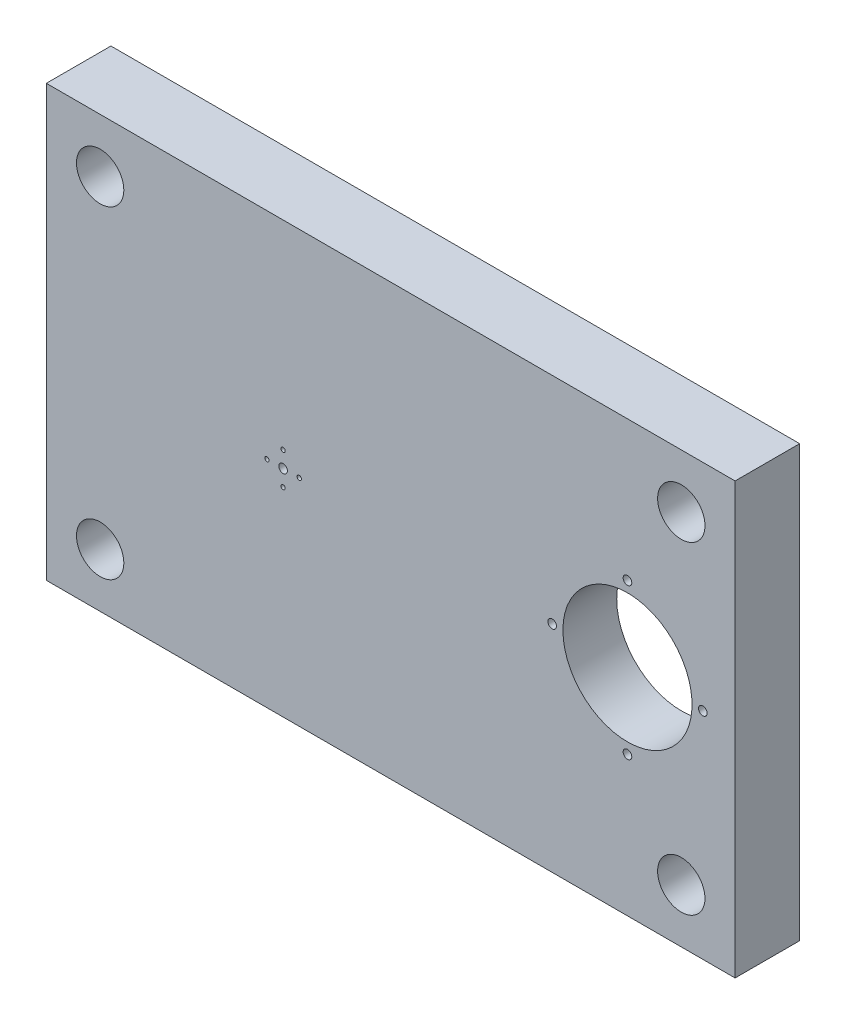
ISO-10303-21;
HEADER;
FILE_DESCRIPTION(('STEP AP214'),'2;1');
FILE_NAME('part.step','',(''),(''),'','','');
FILE_SCHEMA(('AUTOMOTIVE_DESIGN { 1 0 10303 214 1 1 1 1 }'));
ENDSEC;
DATA;
#1=APPLICATION_CONTEXT('core data for automotive mechanical design processes');
#2=APPLICATION_PROTOCOL_DEFINITION('international standard','automotive_design',2000,#1);
#3=PRODUCT_CONTEXT('',#1,'mechanical');
#4=PRODUCT('Part','Part','',(#3));
#5=PRODUCT_RELATED_PRODUCT_CATEGORY('part','',(#4));
#6=PRODUCT_DEFINITION_FORMATION('','',#4);
#7=PRODUCT_DEFINITION_CONTEXT('part definition',#1,'design');
#8=PRODUCT_DEFINITION('design','',#6,#7);
#9=PRODUCT_DEFINITION_SHAPE('','',#8);
#10=(LENGTH_UNIT() NAMED_UNIT(*) SI_UNIT(.MILLI.,.METRE.));
#11=(NAMED_UNIT(*) PLANE_ANGLE_UNIT() SI_UNIT($,.RADIAN.));
#12=(NAMED_UNIT(*) SI_UNIT($,.STERADIAN.) SOLID_ANGLE_UNIT());
#13=UNCERTAINTY_MEASURE_WITH_UNIT(LENGTH_MEASURE(1.E-05),#10,'distance_accuracy_value','');
#14=(GEOMETRIC_REPRESENTATION_CONTEXT(3) GLOBAL_UNCERTAINTY_ASSIGNED_CONTEXT((#13)) GLOBAL_UNIT_ASSIGNED_CONTEXT((#10,
#11,#12)) REPRESENTATION_CONTEXT('',''));
#15=CARTESIAN_POINT('',(0.,0.,0.));
#16=DIRECTION('',(0.,0.,1.));
#17=DIRECTION('',(1.,0.,0.));
#18=AXIS2_PLACEMENT_3D('',#15,#16,#17);
#19=CARTESIAN_POINT('',(0.,0.,30.));
#20=DIRECTION('',(1.,0.,0.));
#21=DIRECTION('',(0.,0.,-1.));
#22=AXIS2_PLACEMENT_3D('',#19,#20,#21);
#23=PLANE('',#22);
#24=DIRECTION('',(0.,-1.,0.));
#25=VECTOR('',#24,1.);
#26=CARTESIAN_POINT('',(0.,0.,0.));
#27=LINE('',#26,#25);
#28=CARTESIAN_POINT('',(0.,200.,0.));
#29=VERTEX_POINT('',#28);
#30=CARTESIAN_POINT('',(0.,0.,0.));
#31=VERTEX_POINT('',#30);
#32=EDGE_CURVE('E195',#29,#31,#27,.T.);
#33=ORIENTED_EDGE('',*,*,#32,.T.);
#34=DIRECTION('',(0.,0.,-1.));
#35=VECTOR('',#34,1.);
#36=CARTESIAN_POINT('',(0.,0.,30.));
#37=LINE('',#36,#35);
#38=CARTESIAN_POINT('',(0.,0.,30.));
#39=VERTEX_POINT('',#38);
#40=EDGE_CURVE('E222',#39,#31,#37,.T.);
#41=ORIENTED_EDGE('',*,*,#40,.F.);
#42=DIRECTION('',(0.,-1.,0.));
#43=VECTOR('',#42,1.);
#44=CARTESIAN_POINT('',(0.,0.,30.));
#45=LINE('',#44,#43);
#46=CARTESIAN_POINT('',(0.,200.,30.));
#47=VERTEX_POINT('',#46);
#48=EDGE_CURVE('E196',#47,#39,#45,.T.);
#49=ORIENTED_EDGE('',*,*,#48,.F.);
#50=DIRECTION('',(0.,0.,-1.));
#51=VECTOR('',#50,1.);
#52=CARTESIAN_POINT('',(0.,200.,30.));
#53=LINE('',#52,#51);
#54=EDGE_CURVE('E206',#47,#29,#53,.T.);
#55=ORIENTED_EDGE('',*,*,#54,.T.);
#56=EDGE_LOOP('',(#33,#41,#49,#55));
#57=FACE_BOUND('',#56,.T.);
#58=DIRECTION('',(0.,1.,0.));
#59=VECTOR('',#58,1.);
#60=CARTESIAN_POINT('',(0.,0.,25.));
#61=LINE('',#60,#59);
#62=CARTESIAN_POINT('',(0.,84.,25.));
#63=VERTEX_POINT('',#62);
#64=CARTESIAN_POINT('',(0.,116.,25.));
#65=VERTEX_POINT('',#64);
#66=EDGE_CURVE('E11',#63,#65,#61,.T.);
#67=ORIENTED_EDGE('',*,*,#66,.F.);
#68=DIRECTION('',(0.,0.,-1.));
#69=VECTOR('',#68,1.);
#70=CARTESIAN_POINT('',(0.,84.,30.));
#71=LINE('',#70,#69);
#72=CARTESIAN_POINT('',(0.,84.,5.));
#73=VERTEX_POINT('',#72);
#74=EDGE_CURVE('E127',#63,#73,#71,.T.);
#75=ORIENTED_EDGE('',*,*,#74,.T.);
#76=DIRECTION('',(0.,1.,0.));
#77=VECTOR('',#76,1.);
#78=CARTESIAN_POINT('',(0.,0.,5.));
#79=LINE('',#78,#77);
#80=CARTESIAN_POINT('',(0.,116.,5.));
#81=VERTEX_POINT('',#80);
#82=EDGE_CURVE('E225',#73,#81,#79,.T.);
#83=ORIENTED_EDGE('',*,*,#82,.T.);
#84=DIRECTION('',(0.,0.,1.));
#85=VECTOR('',#84,1.);
#86=CARTESIAN_POINT('',(0.,116.,30.));
#87=LINE('',#86,#85);
#88=EDGE_CURVE('E48',#81,#65,#87,.T.);
#89=ORIENTED_EDGE('',*,*,#88,.T.);
#90=EDGE_LOOP('',(#67,#75,#83,#89));
#91=FACE_BOUND('',#90,.T.);
#92=ADVANCED_FACE('F40',(#57,#91),#23,.F.);
#93=CARTESIAN_POINT('',(295.,175.,30.));
#94=DIRECTION('',(0.,0.,-1.));
#95=DIRECTION('',(-1.,0.,0.));
#96=AXIS2_PLACEMENT_3D('',#93,#94,#95);
#97=CYLINDRICAL_SURFACE('',#96,8.09999999999998);
#98=CARTESIAN_POINT('',(295.,175.,0.));
#99=DIRECTION('',(0.,0.,1.));
#100=DIRECTION('',(1.,0.,0.));
#101=AXIS2_PLACEMENT_3D('',#98,#99,#100);
#102=CIRCLE('',#101,8.09999999999998);
#103=CARTESIAN_POINT('',(303.1,175.,0.));
#104=VERTEX_POINT('',#103);
#105=EDGE_CURVE('E189',#104,#104,#102,.T.);
#106=ORIENTED_EDGE('',*,*,#105,.F.);
#107=EDGE_LOOP('',(#106));
#108=FACE_BOUND('',#107,.T.);
#109=CARTESIAN_POINT('',(295.,175.,10.));
#110=DIRECTION('',(0.,0.,1.));
#111=DIRECTION('',(1.,0.,0.));
#112=AXIS2_PLACEMENT_3D('',#109,#110,#111);
#113=CIRCLE('',#112,8.09999999999998);
#114=CARTESIAN_POINT('',(303.1,175.,10.));
#115=VERTEX_POINT('',#114);
#116=EDGE_CURVE('E159',#115,#115,#113,.T.);
#117=ORIENTED_EDGE('',*,*,#116,.T.);
#118=EDGE_LOOP('',(#117));
#119=FACE_BOUND('',#118,.T.);
#120=ADVANCED_FACE('F321',(#108,#119),#97,.F.);
#121=CARTESIAN_POINT('',(295.,25.,30.));
#122=DIRECTION('',(0.,0.,-1.));
#123=DIRECTION('',(-1.,0.,0.));
#124=AXIS2_PLACEMENT_3D('',#121,#122,#123);
#125=CYLINDRICAL_SURFACE('',#124,8.09999999999998);
#126=CARTESIAN_POINT('',(295.,25.,0.));
#127=DIRECTION('',(0.,0.,1.));
#128=DIRECTION('',(1.,0.,0.));
#129=AXIS2_PLACEMENT_3D('',#126,#127,#128);
#130=CIRCLE('',#129,8.09999999999998);
#131=CARTESIAN_POINT('',(303.1,25.,0.));
#132=VERTEX_POINT('',#131);
#133=EDGE_CURVE('E183',#132,#132,#130,.T.);
#134=ORIENTED_EDGE('',*,*,#133,.F.);
#135=EDGE_LOOP('',(#134));
#136=FACE_BOUND('',#135,.T.);
#137=CARTESIAN_POINT('',(295.,25.,10.));
#138=DIRECTION('',(0.,0.,1.));
#139=DIRECTION('',(1.,0.,0.));
#140=AXIS2_PLACEMENT_3D('',#137,#138,#139);
#141=CIRCLE('',#140,8.09999999999998);
#142=CARTESIAN_POINT('',(303.1,25.,10.));
#143=VERTEX_POINT('',#142);
#144=EDGE_CURVE('E165',#143,#143,#141,.T.);
#145=ORIENTED_EDGE('',*,*,#144,.T.);
#146=EDGE_LOOP('',(#145));
#147=FACE_BOUND('',#146,.T.);
#148=ADVANCED_FACE('F326',(#136,#147),#125,.F.);
#149=CARTESIAN_POINT('',(25.,25.,30.));
#150=DIRECTION('',(0.,0.,-1.));
#151=DIRECTION('',(-1.,0.,0.));
#152=AXIS2_PLACEMENT_3D('',#149,#150,#151);
#153=CYLINDRICAL_SURFACE('',#152,8.1);
#154=CARTESIAN_POINT('',(25.,25.,0.));
#155=DIRECTION('',(0.,0.,1.));
#156=DIRECTION('',(1.,0.,0.));
#157=AXIS2_PLACEMENT_3D('',#154,#155,#156);
#158=CIRCLE('',#157,8.1);
#159=CARTESIAN_POINT('',(33.1,25.,0.));
#160=VERTEX_POINT('',#159);
#161=EDGE_CURVE('E186',#160,#160,#158,.T.);
#162=ORIENTED_EDGE('',*,*,#161,.F.);
#163=EDGE_LOOP('',(#162));
#164=FACE_BOUND('',#163,.T.);
#165=CARTESIAN_POINT('',(25.,25.,10.));
#166=DIRECTION('',(0.,0.,1.));
#167=DIRECTION('',(1.,0.,0.));
#168=AXIS2_PLACEMENT_3D('',#165,#166,#167);
#169=CIRCLE('',#168,8.1);
#170=CARTESIAN_POINT('',(33.1,25.,10.));
#171=VERTEX_POINT('',#170);
#172=EDGE_CURVE('E172',#171,#171,#169,.T.);
#173=ORIENTED_EDGE('',*,*,#172,.T.);
#174=EDGE_LOOP('',(#173));
#175=FACE_BOUND('',#174,.T.);
#176=ADVANCED_FACE('F364',(#164,#175),#153,.F.);
#177=CARTESIAN_POINT('',(25.,175.,30.));
#178=DIRECTION('',(0.,0.,-1.));
#179=DIRECTION('',(-1.,0.,0.));
#180=AXIS2_PLACEMENT_3D('',#177,#178,#179);
#181=CYLINDRICAL_SURFACE('',#180,8.09999999999999);
#182=CARTESIAN_POINT('',(25.,175.,0.));
#183=DIRECTION('',(0.,0.,1.));
#184=DIRECTION('',(1.,0.,0.));
#185=AXIS2_PLACEMENT_3D('',#182,#183,#184);
#186=CIRCLE('',#185,8.09999999999999);
#187=CARTESIAN_POINT('',(33.1,175.,0.));
#188=VERTEX_POINT('',#187);
#189=EDGE_CURVE('E192',#188,#188,#186,.T.);
#190=ORIENTED_EDGE('',*,*,#189,.F.);
#191=EDGE_LOOP('',(#190));
#192=FACE_BOUND('',#191,.T.);
#193=CARTESIAN_POINT('',(25.,175.,10.));
#194=DIRECTION('',(0.,0.,1.));
#195=DIRECTION('',(1.,0.,0.));
#196=AXIS2_PLACEMENT_3D('',#193,#194,#195);
#197=CIRCLE('',#196,8.09999999999999);
#198=CARTESIAN_POINT('',(33.1,175.,10.));
#199=VERTEX_POINT('',#198);
#200=EDGE_CURVE('E179',#199,#199,#197,.T.);
#201=ORIENTED_EDGE('',*,*,#200,.T.);
#202=EDGE_LOOP('',(#201));
#203=FACE_BOUND('',#202,.T.);
#204=ADVANCED_FACE('F384',(#192,#203),#181,.F.);
#205=CARTESIAN_POINT('',(0.,200.,30.));
#206=DIRECTION('',(0.,0.,-1.));
#207=DIRECTION('',(-1.,0.,0.));
#208=AXIS2_PLACEMENT_3D('',#205,#206,#207);
#209=PLANE('',#208);
#210=CARTESIAN_POINT('',(102.5,100.,30.));
#211=DIRECTION('',(0.,0.,1.));
#212=DIRECTION('',(1.,0.,0.));
#213=AXIS2_PLACEMENT_3D('',#210,#211,#212);
#214=CIRCLE('',#213,0.999999999999998);
#215=CARTESIAN_POINT('',(103.5,100.,30.));
#216=VERTEX_POINT('',#215);
#217=EDGE_CURVE('E279',#216,#216,#214,.T.);
#218=ORIENTED_EDGE('',*,*,#217,.F.);
#219=EDGE_LOOP('',(#218));
#220=FACE_BOUND('',#219,.T.);
#221=CARTESIAN_POINT('',(110.,92.5,30.));
#222=DIRECTION('',(0.,0.,1.));
#223=DIRECTION('',(1.,0.,0.));
#224=AXIS2_PLACEMENT_3D('',#221,#222,#223);
#225=CIRCLE('',#224,0.999999999999998);
#226=CARTESIAN_POINT('',(111.,92.5,30.));
#227=VERTEX_POINT('',#226);
#228=EDGE_CURVE('E269',#227,#227,#225,.T.);
#229=ORIENTED_EDGE('',*,*,#228,.F.);
#230=EDGE_LOOP('',(#229));
#231=FACE_BOUND('',#230,.T.);
#232=CARTESIAN_POINT('',(117.5,100.,30.));
#233=DIRECTION('',(0.,0.,1.));
#234=DIRECTION('',(1.,0.,0.));
#235=AXIS2_PLACEMENT_3D('',#232,#233,#234);
#236=CIRCLE('',#235,0.999999999999998);
#237=CARTESIAN_POINT('',(118.5,100.,30.));
#238=VERTEX_POINT('',#237);
#239=EDGE_CURVE('E266',#238,#238,#236,.T.);
#240=ORIENTED_EDGE('',*,*,#239,.F.);
#241=EDGE_LOOP('',(#240));
#242=FACE_BOUND('',#241,.T.);
#243=CARTESIAN_POINT('',(110.,107.5,30.));
#244=DIRECTION('',(0.,0.,1.));
#245=DIRECTION('',(1.,0.,0.));
#246=AXIS2_PLACEMENT_3D('',#243,#244,#245);
#247=CIRCLE('',#246,0.999999999999998);
#248=CARTESIAN_POINT('',(111.,107.5,30.));
#249=VERTEX_POINT('',#248);
#250=EDGE_CURVE('E263',#249,#249,#247,.T.);
#251=ORIENTED_EDGE('',*,*,#250,.F.);
#252=EDGE_LOOP('',(#251));
#253=FACE_BOUND('',#252,.T.);
#254=CARTESIAN_POINT('',(305.,100.,30.));
#255=DIRECTION('',(0.,0.,-1.));
#256=DIRECTION('',(-1.,0.,0.));
#257=AXIS2_PLACEMENT_3D('',#254,#255,#256);
#258=CIRCLE('',#257,2.);
#259=CARTESIAN_POINT('',(303.,100.,30.));
#260=VERTEX_POINT('',#259);
#261=EDGE_CURVE('E259',#260,#260,#258,.T.);
#262=ORIENTED_EDGE('',*,*,#261,.T.);
#263=EDGE_LOOP('',(#262));
#264=FACE_BOUND('',#263,.T.);
#265=CARTESIAN_POINT('',(270.,65.,30.));
#266=DIRECTION('',(0.,0.,-1.));
#267=DIRECTION('',(-1.,0.,0.));
#268=AXIS2_PLACEMENT_3D('',#265,#266,#267);
#269=CIRCLE('',#268,2.);
#270=CARTESIAN_POINT('',(268.,65.,30.));
#271=VERTEX_POINT('',#270);
#272=EDGE_CURVE('E255',#271,#271,#269,.T.);
#273=ORIENTED_EDGE('',*,*,#272,.T.);
#274=EDGE_LOOP('',(#273));
#275=FACE_BOUND('',#274,.T.);
#276=CARTESIAN_POINT('',(235.,100.,30.));
#277=DIRECTION('',(0.,0.,-1.));
#278=DIRECTION('',(-1.,0.,0.));
#279=AXIS2_PLACEMENT_3D('',#276,#277,#278);
#280=CIRCLE('',#279,2.);
#281=CARTESIAN_POINT('',(233.,100.,30.));
#282=VERTEX_POINT('',#281);
#283=EDGE_CURVE('E251',#282,#282,#280,.T.);
#284=ORIENTED_EDGE('',*,*,#283,.T.);
#285=EDGE_LOOP('',(#284));
#286=FACE_BOUND('',#285,.T.);
#287=CARTESIAN_POINT('',(270.,135.,30.));
#288=DIRECTION('',(0.,0.,-1.));
#289=DIRECTION('',(-1.,0.,0.));
#290=AXIS2_PLACEMENT_3D('',#287,#288,#289);
#291=CIRCLE('',#290,2.);
#292=CARTESIAN_POINT('',(268.,135.,30.));
#293=VERTEX_POINT('',#292);
#294=EDGE_CURVE('E247',#293,#293,#291,.T.);
#295=ORIENTED_EDGE('',*,*,#294,.T.);
#296=EDGE_LOOP('',(#295));
#297=FACE_BOUND('',#296,.T.);
#298=CARTESIAN_POINT('',(270.,100.,30.));
#299=DIRECTION('',(0.,0.,-1.));
#300=DIRECTION('',(-1.,0.,0.));
#301=AXIS2_PLACEMENT_3D('',#298,#299,#300);
#302=CIRCLE('',#301,30.);
#303=CARTESIAN_POINT('',(240.,100.,30.));
#304=VERTEX_POINT('',#303);
#305=EDGE_CURVE('E243',#304,#304,#302,.T.);
#306=ORIENTED_EDGE('',*,*,#305,.T.);
#307=EDGE_LOOP('',(#306));
#308=FACE_BOUND('',#307,.T.);
#309=CARTESIAN_POINT('',(110.,100.,30.));
#310=DIRECTION('',(0.,0.,-1.));
#311=DIRECTION('',(-1.,0.,0.));
#312=AXIS2_PLACEMENT_3D('',#309,#310,#311);
#313=CIRCLE('',#312,2.);
#314=CARTESIAN_POINT('',(108.,100.,30.));
#315=VERTEX_POINT('',#314);
#316=EDGE_CURVE('E144',#315,#315,#313,.T.);
#317=ORIENTED_EDGE('',*,*,#316,.T.);
#318=EDGE_LOOP('',(#317));
#319=FACE_BOUND('',#318,.T.);
#320=CARTESIAN_POINT('',(295.,175.,30.));
#321=DIRECTION('',(0.,0.,1.));
#322=DIRECTION('',(1.,0.,0.));
#323=AXIS2_PLACEMENT_3D('',#320,#321,#322);
#324=CIRCLE('',#323,11.);
#325=CARTESIAN_POINT('',(306.,175.,30.));
#326=VERTEX_POINT('',#325);
#327=EDGE_CURVE('E152',#326,#326,#324,.T.);
#328=ORIENTED_EDGE('',*,*,#327,.F.);
#329=EDGE_LOOP('',(#328));
#330=FACE_BOUND('',#329,.T.);
#331=CARTESIAN_POINT('',(295.,25.,30.));
#332=DIRECTION('',(0.,0.,1.));
#333=DIRECTION('',(1.,0.,0.));
#334=AXIS2_PLACEMENT_3D('',#331,#332,#333);
#335=CIRCLE('',#334,11.);
#336=CARTESIAN_POINT('',(306.,25.,30.));
#337=VERTEX_POINT('',#336);
#338=EDGE_CURVE('E166',#337,#337,#335,.T.);
#339=ORIENTED_EDGE('',*,*,#338,.F.);
#340=EDGE_LOOP('',(#339));
#341=FACE_BOUND('',#340,.T.);
#342=CARTESIAN_POINT('',(25.,25.,30.));
#343=DIRECTION('',(0.,0.,1.));
#344=DIRECTION('',(1.,0.,0.));
#345=AXIS2_PLACEMENT_3D('',#342,#343,#344);
#346=CIRCLE('',#345,11.);
#347=CARTESIAN_POINT('',(36.,25.,30.));
#348=VERTEX_POINT('',#347);
#349=EDGE_CURVE('E173',#348,#348,#346,.T.);
#350=ORIENTED_EDGE('',*,*,#349,.F.);
#351=EDGE_LOOP('',(#350));
#352=FACE_BOUND('',#351,.T.);
#353=CARTESIAN_POINT('',(25.,175.,30.));
#354=DIRECTION('',(0.,0.,1.));
#355=DIRECTION('',(1.,0.,0.));
#356=AXIS2_PLACEMENT_3D('',#353,#354,#355);
#357=CIRCLE('',#356,11.);
#358=CARTESIAN_POINT('',(36.,175.,30.));
#359=VERTEX_POINT('',#358);
#360=EDGE_CURVE('E180',#359,#359,#357,.T.);
#361=ORIENTED_EDGE('',*,*,#360,.F.);
#362=EDGE_LOOP('',(#361));
#363=FACE_BOUND('',#362,.T.);
#364=ORIENTED_EDGE('',*,*,#48,.T.);
#365=DIRECTION('',(1.,0.,0.));
#366=VECTOR('',#365,1.);
#367=CARTESIAN_POINT('',(0.,0.,30.));
#368=LINE('',#367,#366);
#369=CARTESIAN_POINT('',(320.,0.,30.));
#370=VERTEX_POINT('',#369);
#371=EDGE_CURVE('E199',#39,#370,#368,.T.);
#372=ORIENTED_EDGE('',*,*,#371,.T.);
#373=DIRECTION('',(0.,1.,0.));
#374=VECTOR('',#373,1.);
#375=CARTESIAN_POINT('',(320.,0.,30.));
#376=LINE('',#375,#374);
#377=CARTESIAN_POINT('',(320.,200.,30.));
#378=VERTEX_POINT('',#377);
#379=EDGE_CURVE('E202',#370,#378,#376,.T.);
#380=ORIENTED_EDGE('',*,*,#379,.T.);
#381=DIRECTION('',(-1.,0.,0.));
#382=VECTOR('',#381,1.);
#383=CARTESIAN_POINT('',(0.,200.,30.));
#384=LINE('',#383,#382);
#385=EDGE_CURVE('E204',#378,#47,#384,.T.);
#386=ORIENTED_EDGE('',*,*,#385,.T.);
#387=EDGE_LOOP('',(#364,#372,#380,#386));
#388=FACE_BOUND('',#387,.T.);
#389=ADVANCED_FACE('F349',(#220,#231,#242,#253,#264,#275,#286,#297,#308,#319,#330,#341,#352,
#363,#388),#209,.F.);
#390=CARTESIAN_POINT('',(0.,200.,0.));
#391=DIRECTION('',(0.,0.,-1.));
#392=DIRECTION('',(-1.,0.,0.));
#393=AXIS2_PLACEMENT_3D('',#390,#391,#392);
#394=PLANE('',#393);
#395=CARTESIAN_POINT('',(270.,100.,0.));
#396=DIRECTION('',(0.,0.,-1.));
#397=DIRECTION('',(-1.,0.,0.));
#398=AXIS2_PLACEMENT_3D('',#395,#396,#397);
#399=CIRCLE('',#398,40.);
#400=CARTESIAN_POINT('',(230.,100.,0.));
#401=VERTEX_POINT('',#400);
#402=EDGE_CURVE('E242',#401,#401,#399,.T.);
#403=ORIENTED_EDGE('',*,*,#402,.F.);
#404=EDGE_LOOP('',(#403));
#405=FACE_BOUND('',#404,.T.);
#406=CARTESIAN_POINT('',(110.,100.,0.));
#407=DIRECTION('',(0.,0.,-1.));
#408=DIRECTION('',(-1.,0.,0.));
#409=AXIS2_PLACEMENT_3D('',#406,#407,#408);
#410=CIRCLE('',#409,58.5);
#411=CARTESIAN_POINT('',(51.5,100.,0.));
#412=VERTEX_POINT('',#411);
#413=EDGE_CURVE('E153',#412,#412,#410,.T.);
#414=ORIENTED_EDGE('',*,*,#413,.F.);
#415=EDGE_LOOP('',(#414));
#416=FACE_BOUND('',#415,.T.);
#417=ORIENTED_EDGE('',*,*,#161,.T.);
#418=EDGE_LOOP('',(#417));
#419=FACE_BOUND('',#418,.T.);
#420=ORIENTED_EDGE('',*,*,#189,.T.);
#421=EDGE_LOOP('',(#420));
#422=FACE_BOUND('',#421,.T.);
#423=ORIENTED_EDGE('',*,*,#32,.F.);
#424=DIRECTION('',(-1.,0.,0.));
#425=VECTOR('',#424,1.);
#426=CARTESIAN_POINT('',(0.,200.,0.));
#427=LINE('',#426,#425);
#428=CARTESIAN_POINT('',(320.,200.,0.));
#429=VERTEX_POINT('',#428);
#430=EDGE_CURVE('E200',#429,#29,#427,.T.);
#431=ORIENTED_EDGE('',*,*,#430,.F.);
#432=DIRECTION('',(0.,1.,0.));
#433=VECTOR('',#432,1.);
#434=CARTESIAN_POINT('',(320.,0.,0.));
#435=LINE('',#434,#433);
#436=CARTESIAN_POINT('',(320.,0.,0.));
#437=VERTEX_POINT('',#436);
#438=EDGE_CURVE('E211',#437,#429,#435,.T.);
#439=ORIENTED_EDGE('',*,*,#438,.F.);
#440=DIRECTION('',(1.,0.,0.));
#441=VECTOR('',#440,1.);
#442=CARTESIAN_POINT('',(0.,0.,0.));
#443=LINE('',#442,#441);
#444=EDGE_CURVE('E209',#31,#437,#443,.T.);
#445=ORIENTED_EDGE('',*,*,#444,.F.);
#446=EDGE_LOOP('',(#423,#431,#439,#445));
#447=FACE_BOUND('',#446,.T.);
#448=ORIENTED_EDGE('',*,*,#105,.T.);
#449=EDGE_LOOP('',(#448));
#450=FACE_BOUND('',#449,.T.);
#451=ORIENTED_EDGE('',*,*,#133,.T.);
#452=EDGE_LOOP('',(#451));
#453=FACE_BOUND('',#452,.T.);
#454=ADVANCED_FACE('F345',(#405,#416,#419,#422,#447,#450,#453),#394,.T.);
#455=CARTESIAN_POINT('',(0.,0.,30.));
#456=DIRECTION('',(0.,1.,0.));
#457=DIRECTION('',(0.,0.,1.));
#458=AXIS2_PLACEMENT_3D('',#455,#456,#457);
#459=PLANE('',#458);
#460=ORIENTED_EDGE('',*,*,#444,.T.);
#461=DIRECTION('',(0.,0.,-1.));
#462=VECTOR('',#461,1.);
#463=CARTESIAN_POINT('',(320.,0.,30.));
#464=LINE('',#463,#462);
#465=EDGE_CURVE('E219',#370,#437,#464,.T.);
#466=ORIENTED_EDGE('',*,*,#465,.F.);
#467=ORIENTED_EDGE('',*,*,#371,.F.);
#468=ORIENTED_EDGE('',*,*,#40,.T.);
#469=EDGE_LOOP('',(#460,#466,#467,#468));
#470=FACE_BOUND('',#469,.T.);
#471=ADVANCED_FACE('F348',(#470),#459,.F.);
#472=CARTESIAN_POINT('',(320.,0.,30.));
#473=DIRECTION('',(-1.,0.,0.));
#474=DIRECTION('',(0.,0.,1.));
#475=AXIS2_PLACEMENT_3D('',#472,#473,#474);
#476=PLANE('',#475);
#477=ORIENTED_EDGE('',*,*,#438,.T.);
#478=DIRECTION('',(0.,0.,-1.));
#479=VECTOR('',#478,1.);
#480=CARTESIAN_POINT('',(320.,200.,30.));
#481=LINE('',#480,#479);
#482=EDGE_CURVE('E216',#378,#429,#481,.T.);
#483=ORIENTED_EDGE('',*,*,#482,.F.);
#484=ORIENTED_EDGE('',*,*,#379,.F.);
#485=ORIENTED_EDGE('',*,*,#465,.T.);
#486=EDGE_LOOP('',(#477,#483,#484,#485));
#487=FACE_BOUND('',#486,.T.);
#488=ADVANCED_FACE('F400',(#487),#476,.F.);
#489=CARTESIAN_POINT('',(0.,200.,30.));
#490=DIRECTION('',(0.,-1.,0.));
#491=DIRECTION('',(0.,0.,-1.));
#492=AXIS2_PLACEMENT_3D('',#489,#490,#491);
#493=PLANE('',#492);
#494=ORIENTED_EDGE('',*,*,#430,.T.);
#495=ORIENTED_EDGE('',*,*,#54,.F.);
#496=ORIENTED_EDGE('',*,*,#385,.F.);
#497=ORIENTED_EDGE('',*,*,#482,.T.);
#498=EDGE_LOOP('',(#494,#495,#496,#497));
#499=FACE_BOUND('',#498,.T.);
#500=ADVANCED_FACE('F402',(#499),#493,.F.);
#501=CARTESIAN_POINT('',(25.,175.,10.));
#502=DIRECTION('',(0.,0.,1.));
#503=DIRECTION('',(1.,0.,0.));
#504=AXIS2_PLACEMENT_3D('',#501,#502,#503);
#505=CYLINDRICAL_SURFACE('',#504,11.);
#506=CARTESIAN_POINT('',(25.,175.,10.));
#507=DIRECTION('',(0.,0.,1.));
#508=DIRECTION('',(1.,0.,0.));
#509=AXIS2_PLACEMENT_3D('',#506,#507,#508);
#510=CIRCLE('',#509,11.);
#511=CARTESIAN_POINT('',(36.,175.,10.));
#512=VERTEX_POINT('',#511);
#513=EDGE_CURVE('E176',#512,#512,#510,.T.);
#514=ORIENTED_EDGE('',*,*,#513,.F.);
#515=EDGE_LOOP('',(#514));
#516=FACE_BOUND('',#515,.T.);
#517=ORIENTED_EDGE('',*,*,#360,.T.);
#518=EDGE_LOOP('',(#517));
#519=FACE_BOUND('',#518,.T.);
#520=ADVANCED_FACE('F404',(#516,#519),#505,.F.);
#521=CARTESIAN_POINT('',(25.,175.,10.));
#522=DIRECTION('',(0.,0.,1.));
#523=DIRECTION('',(1.,0.,0.));
#524=AXIS2_PLACEMENT_3D('',#521,#522,#523);
#525=PLANE('',#524);
#526=ORIENTED_EDGE('',*,*,#200,.F.);
#527=EDGE_LOOP('',(#526));
#528=FACE_BOUND('',#527,.T.);
#529=ORIENTED_EDGE('',*,*,#513,.T.);
#530=EDGE_LOOP('',(#529));
#531=FACE_BOUND('',#530,.T.);
#532=ADVANCED_FACE('F410',(#528,#531),#525,.T.);
#533=CARTESIAN_POINT('',(25.,25.,10.));
#534=DIRECTION('',(0.,0.,1.));
#535=DIRECTION('',(1.,0.,0.));
#536=AXIS2_PLACEMENT_3D('',#533,#534,#535);
#537=CYLINDRICAL_SURFACE('',#536,11.);
#538=CARTESIAN_POINT('',(25.,25.,10.));
#539=DIRECTION('',(0.,0.,1.));
#540=DIRECTION('',(1.,0.,0.));
#541=AXIS2_PLACEMENT_3D('',#538,#539,#540);
#542=CIRCLE('',#541,11.);
#543=CARTESIAN_POINT('',(36.,25.,10.));
#544=VERTEX_POINT('',#543);
#545=EDGE_CURVE('E169',#544,#544,#542,.T.);
#546=ORIENTED_EDGE('',*,*,#545,.F.);
#547=EDGE_LOOP('',(#546));
#548=FACE_BOUND('',#547,.T.);
#549=ORIENTED_EDGE('',*,*,#349,.T.);
#550=EDGE_LOOP('',(#549));
#551=FACE_BOUND('',#550,.T.);
#552=ADVANCED_FACE('F472',(#548,#551),#537,.F.);
#553=CARTESIAN_POINT('',(25.,25.,10.));
#554=DIRECTION('',(0.,0.,1.));
#555=DIRECTION('',(1.,0.,0.));
#556=AXIS2_PLACEMENT_3D('',#553,#554,#555);
#557=PLANE('',#556);
#558=ORIENTED_EDGE('',*,*,#172,.F.);
#559=EDGE_LOOP('',(#558));
#560=FACE_BOUND('',#559,.T.);
#561=ORIENTED_EDGE('',*,*,#545,.T.);
#562=EDGE_LOOP('',(#561));
#563=FACE_BOUND('',#562,.T.);
#564=ADVANCED_FACE('F378',(#560,#563),#557,.T.);
#565=CARTESIAN_POINT('',(295.,25.,10.));
#566=DIRECTION('',(0.,0.,1.));
#567=DIRECTION('',(1.,0.,0.));
#568=AXIS2_PLACEMENT_3D('',#565,#566,#567);
#569=CYLINDRICAL_SURFACE('',#568,11.);
#570=CARTESIAN_POINT('',(295.,25.,10.));
#571=DIRECTION('',(0.,0.,1.));
#572=DIRECTION('',(1.,0.,0.));
#573=AXIS2_PLACEMENT_3D('',#570,#571,#572);
#574=CIRCLE('',#573,11.);
#575=CARTESIAN_POINT('',(306.,25.,10.));
#576=VERTEX_POINT('',#575);
#577=EDGE_CURVE('E162',#576,#576,#574,.T.);
#578=ORIENTED_EDGE('',*,*,#577,.F.);
#579=EDGE_LOOP('',(#578));
#580=FACE_BOUND('',#579,.T.);
#581=ORIENTED_EDGE('',*,*,#338,.T.);
#582=EDGE_LOOP('',(#581));
#583=FACE_BOUND('',#582,.T.);
#584=ADVANCED_FACE('F372',(#580,#583),#569,.F.);
#585=CARTESIAN_POINT('',(295.,25.,10.));
#586=DIRECTION('',(0.,0.,1.));
#587=DIRECTION('',(1.,0.,0.));
#588=AXIS2_PLACEMENT_3D('',#585,#586,#587);
#589=PLANE('',#588);
#590=ORIENTED_EDGE('',*,*,#144,.F.);
#591=EDGE_LOOP('',(#590));
#592=FACE_BOUND('',#591,.T.);
#593=ORIENTED_EDGE('',*,*,#577,.T.);
#594=EDGE_LOOP('',(#593));
#595=FACE_BOUND('',#594,.T.);
#596=ADVANCED_FACE('F368',(#592,#595),#589,.T.);
#597=CARTESIAN_POINT('',(295.,175.,10.));
#598=DIRECTION('',(0.,0.,1.));
#599=DIRECTION('',(1.,0.,0.));
#600=AXIS2_PLACEMENT_3D('',#597,#598,#599);
#601=CYLINDRICAL_SURFACE('',#600,11.);
#602=CARTESIAN_POINT('',(295.,175.,10.));
#603=DIRECTION('',(0.,0.,1.));
#604=DIRECTION('',(1.,0.,0.));
#605=AXIS2_PLACEMENT_3D('',#602,#603,#604);
#606=CIRCLE('',#605,11.);
#607=CARTESIAN_POINT('',(306.,175.,10.));
#608=VERTEX_POINT('',#607);
#609=EDGE_CURVE('E156',#608,#608,#606,.T.);
#610=ORIENTED_EDGE('',*,*,#609,.F.);
#611=EDGE_LOOP('',(#610));
#612=FACE_BOUND('',#611,.T.);
#613=ORIENTED_EDGE('',*,*,#327,.T.);
#614=EDGE_LOOP('',(#613));
#615=FACE_BOUND('',#614,.T.);
#616=ADVANCED_FACE('F371',(#612,#615),#601,.F.);
#617=CARTESIAN_POINT('',(295.,175.,10.));
#618=DIRECTION('',(0.,0.,1.));
#619=DIRECTION('',(1.,0.,0.));
#620=AXIS2_PLACEMENT_3D('',#617,#618,#619);
#621=PLANE('',#620);
#622=ORIENTED_EDGE('',*,*,#116,.F.);
#623=EDGE_LOOP('',(#622));
#624=FACE_BOUND('',#623,.T.);
#625=ORIENTED_EDGE('',*,*,#609,.T.);
#626=EDGE_LOOP('',(#625));
#627=FACE_BOUND('',#626,.T.);
#628=ADVANCED_FACE('F341',(#624,#627),#621,.T.);
#629=CARTESIAN_POINT('',(110.,100.,5.));
#630=DIRECTION('',(0.,0.,-1.));
#631=DIRECTION('',(-1.,0.,0.));
#632=AXIS2_PLACEMENT_3D('',#629,#630,#631);
#633=CYLINDRICAL_SURFACE('',#632,58.5);
#634=CARTESIAN_POINT('',(110.,100.,5.));
#635=DIRECTION('',(0.,0.,-1.));
#636=DIRECTION('',(-1.,0.,0.));
#637=AXIS2_PLACEMENT_3D('',#634,#635,#636);
#638=CIRCLE('',#637,58.5);
#639=CARTESIAN_POINT('',(53.7305589151625,116.,5.));
#640=VERTEX_POINT('',#639);
#641=CARTESIAN_POINT('',(53.7305589151625,84.,5.));
#642=VERTEX_POINT('',#641);
#643=EDGE_CURVE('E149',#640,#642,#638,.T.);
#644=ORIENTED_EDGE('',*,*,#643,.F.);
#645=EDGE_CURVE('E147',#642,#640,#638,.T.);
#646=ORIENTED_EDGE('',*,*,#645,.F.);
#647=EDGE_LOOP('',(#644,#646));
#648=FACE_BOUND('',#647,.T.);
#649=ORIENTED_EDGE('',*,*,#413,.T.);
#650=EDGE_LOOP('',(#649));
#651=FACE_BOUND('',#650,.T.);
#652=ADVANCED_FACE('F338',(#648,#651),#633,.F.);
#653=CARTESIAN_POINT('',(110.,100.,5.));
#654=DIRECTION('',(0.,0.,-1.));
#655=DIRECTION('',(-1.,0.,0.));
#656=AXIS2_PLACEMENT_3D('',#653,#654,#655);
#657=PLANE('',#656);
#658=DIRECTION('',(-1.,0.,0.));
#659=VECTOR('',#658,1.);
#660=CARTESIAN_POINT('',(110.,84.,5.));
#661=LINE('',#660,#659);
#662=CARTESIAN_POINT('',(110.,84.,5.));
#663=VERTEX_POINT('',#662);
#664=EDGE_CURVE('E145',#663,#642,#661,.T.);
#665=ORIENTED_EDGE('',*,*,#664,.F.);
#666=CARTESIAN_POINT('',(110.,100.,5.));
#667=DIRECTION('',(0.,0.,-1.));
#668=DIRECTION('',(-1.,0.,0.));
#669=AXIS2_PLACEMENT_3D('',#666,#667,#668);
#670=CIRCLE('',#669,16.);
#671=CARTESIAN_POINT('',(110.,116.,5.));
#672=VERTEX_POINT('',#671);
#673=EDGE_CURVE('E115',#672,#663,#670,.T.);
#674=ORIENTED_EDGE('',*,*,#673,.F.);
#675=DIRECTION('',(1.,0.,0.));
#676=VECTOR('',#675,1.);
#677=CARTESIAN_POINT('',(110.,116.,5.));
#678=LINE('',#677,#676);
#679=EDGE_CURVE('E135',#640,#672,#678,.T.);
#680=ORIENTED_EDGE('',*,*,#679,.F.);
#681=ORIENTED_EDGE('',*,*,#643,.T.);
#682=EDGE_LOOP('',(#665,#674,#680,#681));
#683=FACE_BOUND('',#682,.T.);
#684=ADVANCED_FACE('F334',(#683),#657,.T.);
#685=CARTESIAN_POINT('',(110.,116.,25.));
#686=DIRECTION('',(0.,1.,0.));
#687=DIRECTION('',(-1.,0.,0.));
#688=AXIS2_PLACEMENT_3D('',#685,#686,#687);
#689=PLANE('',#688);
#690=EDGE_CURVE('E56',#81,#640,#678,.T.);
#691=ORIENTED_EDGE('',*,*,#690,.T.);
#692=ORIENTED_EDGE('',*,*,#679,.T.);
#693=DIRECTION('',(0.,0.,-1.));
#694=VECTOR('',#693,1.);
#695=CARTESIAN_POINT('',(110.,116.,25.));
#696=LINE('',#695,#694);
#697=CARTESIAN_POINT('',(110.,116.,25.));
#698=VERTEX_POINT('',#697);
#699=EDGE_CURVE('E119',#698,#672,#696,.T.);
#700=ORIENTED_EDGE('',*,*,#699,.F.);
#701=DIRECTION('',(1.,0.,0.));
#702=VECTOR('',#701,1.);
#703=CARTESIAN_POINT('',(110.,116.,25.));
#704=LINE('',#703,#702);
#705=EDGE_CURVE('E120',#65,#698,#704,.T.);
#706=ORIENTED_EDGE('',*,*,#705,.F.);
#707=ORIENTED_EDGE('',*,*,#88,.F.);
#708=EDGE_LOOP('',(#691,#692,#700,#706,#707));
#709=FACE_BOUND('',#708,.T.);
#710=ADVANCED_FACE('F315',(#709),#689,.F.);
#711=CARTESIAN_POINT('',(110.,84.,25.));
#712=DIRECTION('',(0.,-1.,0.));
#713=DIRECTION('',(0.,0.,-1.));
#714=AXIS2_PLACEMENT_3D('',#711,#712,#713);
#715=PLANE('',#714);
#716=DIRECTION('',(-1.,0.,0.));
#717=VECTOR('',#716,1.);
#718=CARTESIAN_POINT('',(110.,84.,25.));
#719=LINE('',#718,#717);
#720=CARTESIAN_POINT('',(110.,84.,25.));
#721=VERTEX_POINT('',#720);
#722=EDGE_CURVE('E123',#721,#63,#719,.T.);
#723=ORIENTED_EDGE('',*,*,#722,.F.);
#724=DIRECTION('',(0.,0.,-1.));
#725=VECTOR('',#724,1.);
#726=CARTESIAN_POINT('',(110.,84.,25.));
#727=LINE('',#726,#725);
#728=EDGE_CURVE('E108',#721,#663,#727,.T.);
#729=ORIENTED_EDGE('',*,*,#728,.T.);
#730=ORIENTED_EDGE('',*,*,#664,.T.);
#731=EDGE_CURVE('E143',#642,#73,#661,.T.);
#732=ORIENTED_EDGE('',*,*,#731,.T.);
#733=ORIENTED_EDGE('',*,*,#74,.F.);
#734=EDGE_LOOP('',(#723,#729,#730,#732,#733));
#735=FACE_BOUND('',#734,.T.);
#736=ADVANCED_FACE('F124',(#735),#715,.F.);
#737=CARTESIAN_POINT('',(110.,100.,25.));
#738=DIRECTION('',(0.,0.,-1.));
#739=DIRECTION('',(-1.,0.,0.));
#740=AXIS2_PLACEMENT_3D('',#737,#738,#739);
#741=PLANE('',#740);
#742=CARTESIAN_POINT('',(102.5,100.,25.));
#743=DIRECTION('',(0.,0.,-1.));
#744=DIRECTION('',(-1.,0.,0.));
#745=AXIS2_PLACEMENT_3D('',#742,#743,#744);
#746=CIRCLE('',#745,0.999999999999998);
#747=CARTESIAN_POINT('',(101.5,100.,25.));
#748=VERTEX_POINT('',#747);
#749=EDGE_CURVE('E43',#748,#748,#746,.T.);
#750=ORIENTED_EDGE('',*,*,#749,.F.);
#751=EDGE_LOOP('',(#750));
#752=FACE_BOUND('',#751,.T.);
#753=CARTESIAN_POINT('',(110.,92.5,25.));
#754=DIRECTION('',(0.,0.,-1.));
#755=DIRECTION('',(-1.,0.,0.));
#756=AXIS2_PLACEMENT_3D('',#753,#754,#755);
#757=CIRCLE('',#756,0.999999999999998);
#758=CARTESIAN_POINT('',(109.,92.5,25.));
#759=VERTEX_POINT('',#758);
#760=EDGE_CURVE('E267',#759,#759,#757,.T.);
#761=ORIENTED_EDGE('',*,*,#760,.F.);
#762=EDGE_LOOP('',(#761));
#763=FACE_BOUND('',#762,.T.);
#764=CARTESIAN_POINT('',(117.5,100.,25.));
#765=DIRECTION('',(0.,0.,-1.));
#766=DIRECTION('',(-1.,0.,0.));
#767=AXIS2_PLACEMENT_3D('',#764,#765,#766);
#768=CIRCLE('',#767,0.999999999999998);
#769=CARTESIAN_POINT('',(116.5,100.,25.));
#770=VERTEX_POINT('',#769);
#771=EDGE_CURVE('E264',#770,#770,#768,.T.);
#772=ORIENTED_EDGE('',*,*,#771,.F.);
#773=EDGE_LOOP('',(#772));
#774=FACE_BOUND('',#773,.T.);
#775=CARTESIAN_POINT('',(110.,107.5,25.));
#776=DIRECTION('',(0.,0.,-1.));
#777=DIRECTION('',(-1.,0.,0.));
#778=AXIS2_PLACEMENT_3D('',#775,#776,#777);
#779=CIRCLE('',#778,0.999999999999998);
#780=CARTESIAN_POINT('',(109.,107.5,25.));
#781=VERTEX_POINT('',#780);
#782=EDGE_CURVE('E260',#781,#781,#779,.T.);
#783=ORIENTED_EDGE('',*,*,#782,.F.);
#784=EDGE_LOOP('',(#783));
#785=FACE_BOUND('',#784,.T.);
#786=CARTESIAN_POINT('',(110.,100.,25.));
#787=DIRECTION('',(0.,0.,-1.));
#788=DIRECTION('',(-1.,0.,0.));
#789=AXIS2_PLACEMENT_3D('',#786,#787,#788);
#790=CIRCLE('',#789,2.);
#791=CARTESIAN_POINT('',(108.,100.,25.));
#792=VERTEX_POINT('',#791);
#793=EDGE_CURVE('E138',#792,#792,#790,.T.);
#794=ORIENTED_EDGE('',*,*,#793,.F.);
#795=EDGE_LOOP('',(#794));
#796=FACE_BOUND('',#795,.T.);
#797=ORIENTED_EDGE('',*,*,#66,.T.);
#798=ORIENTED_EDGE('',*,*,#705,.T.);
#799=CARTESIAN_POINT('',(110.,100.,25.));
#800=DIRECTION('',(0.,0.,-1.));
#801=DIRECTION('',(-1.,0.,0.));
#802=AXIS2_PLACEMENT_3D('',#799,#800,#801);
#803=CIRCLE('',#802,16.);
#804=EDGE_CURVE('E113',#698,#721,#803,.T.);
#805=ORIENTED_EDGE('',*,*,#804,.T.);
#806=ORIENTED_EDGE('',*,*,#722,.T.);
#807=EDGE_LOOP('',(#797,#798,#805,#806));
#808=FACE_BOUND('',#807,.T.);
#809=ADVANCED_FACE('F131',(#752,#763,#774,#785,#796,#808),#741,.T.);
#810=CARTESIAN_POINT('',(110.,100.,5.));
#811=DIRECTION('',(0.,0.,-1.));
#812=DIRECTION('',(-1.,0.,0.));
#813=AXIS2_PLACEMENT_3D('',#810,#811,#812);
#814=PLANE('',#813);
#815=ORIENTED_EDGE('',*,*,#645,.T.);
#816=ORIENTED_EDGE('',*,*,#690,.F.);
#817=ORIENTED_EDGE('',*,*,#82,.F.);
#818=ORIENTED_EDGE('',*,*,#731,.F.);
#819=EDGE_LOOP('',(#815,#816,#817,#818));
#820=FACE_BOUND('',#819,.T.);
#821=ADVANCED_FACE('F307',(#820),#814,.F.);
#822=CARTESIAN_POINT('',(110.,100.,25.));
#823=DIRECTION('',(0.,0.,-1.));
#824=DIRECTION('',(-1.,0.,0.));
#825=AXIS2_PLACEMENT_3D('',#822,#823,#824);
#826=CYLINDRICAL_SURFACE('',#825,16.);
#827=ORIENTED_EDGE('',*,*,#673,.T.);
#828=ORIENTED_EDGE('',*,*,#728,.F.);
#829=ORIENTED_EDGE('',*,*,#804,.F.);
#830=ORIENTED_EDGE('',*,*,#699,.T.);
#831=EDGE_LOOP('',(#827,#828,#829,#830));
#832=FACE_BOUND('',#831,.T.);
#833=ADVANCED_FACE('F110',(#832),#826,.F.);
#834=CARTESIAN_POINT('',(110.,100.,30.));
#835=DIRECTION('',(0.,0.,-1.));
#836=DIRECTION('',(-1.,0.,0.));
#837=AXIS2_PLACEMENT_3D('',#834,#835,#836);
#838=CYLINDRICAL_SURFACE('',#837,2.);
#839=ORIENTED_EDGE('',*,*,#316,.F.);
#840=EDGE_LOOP('',(#839));
#841=FACE_BOUND('',#840,.T.);
#842=ORIENTED_EDGE('',*,*,#793,.T.);
#843=EDGE_LOOP('',(#842));
#844=FACE_BOUND('',#843,.T.);
#845=ADVANCED_FACE('F304',(#841,#844),#838,.F.);
#846=CARTESIAN_POINT('',(270.,100.,5.));
#847=DIRECTION('',(0.,0.,-1.));
#848=DIRECTION('',(-1.,0.,0.));
#849=AXIS2_PLACEMENT_3D('',#846,#847,#848);
#850=CYLINDRICAL_SURFACE('',#849,40.);
#851=CARTESIAN_POINT('',(270.,100.,5.));
#852=DIRECTION('',(0.,0.,-1.));
#853=DIRECTION('',(-1.,0.,0.));
#854=AXIS2_PLACEMENT_3D('',#851,#852,#853);
#855=CIRCLE('',#854,40.);
#856=CARTESIAN_POINT('',(230.,100.,5.));
#857=VERTEX_POINT('',#856);
#858=EDGE_CURVE('E294',#857,#857,#855,.T.);
#859=ORIENTED_EDGE('',*,*,#858,.F.);
#860=EDGE_LOOP('',(#859));
#861=FACE_BOUND('',#860,.T.);
#862=ORIENTED_EDGE('',*,*,#402,.T.);
#863=EDGE_LOOP('',(#862));
#864=FACE_BOUND('',#863,.T.);
#865=ADVANCED_FACE('F576',(#861,#864),#850,.F.);
#866=CARTESIAN_POINT('',(270.,100.,5.));
#867=DIRECTION('',(0.,0.,-1.));
#868=DIRECTION('',(-1.,0.,0.));
#869=AXIS2_PLACEMENT_3D('',#866,#867,#868);
#870=PLANE('',#869);
#871=CARTESIAN_POINT('',(305.,100.,5.));
#872=DIRECTION('',(0.,0.,-1.));
#873=DIRECTION('',(-1.,0.,0.));
#874=AXIS2_PLACEMENT_3D('',#871,#872,#873);
#875=CIRCLE('',#874,2.);
#876=CARTESIAN_POINT('',(303.,100.,5.));
#877=VERTEX_POINT('',#876);
#878=EDGE_CURVE('E256',#877,#877,#875,.T.);
#879=ORIENTED_EDGE('',*,*,#878,.F.);
#880=EDGE_LOOP('',(#879));
#881=FACE_BOUND('',#880,.T.);
#882=CARTESIAN_POINT('',(270.,65.,5.));
#883=DIRECTION('',(0.,0.,-1.));
#884=DIRECTION('',(-1.,0.,0.));
#885=AXIS2_PLACEMENT_3D('',#882,#883,#884);
#886=CIRCLE('',#885,2.);
#887=CARTESIAN_POINT('',(268.,65.,5.));
#888=VERTEX_POINT('',#887);
#889=EDGE_CURVE('E252',#888,#888,#886,.T.);
#890=ORIENTED_EDGE('',*,*,#889,.F.);
#891=EDGE_LOOP('',(#890));
#892=FACE_BOUND('',#891,.T.);
#893=CARTESIAN_POINT('',(235.,100.,5.));
#894=DIRECTION('',(0.,0.,-1.));
#895=DIRECTION('',(-1.,0.,0.));
#896=AXIS2_PLACEMENT_3D('',#893,#894,#895);
#897=CIRCLE('',#896,2.);
#898=CARTESIAN_POINT('',(233.,100.,5.));
#899=VERTEX_POINT('',#898);
#900=EDGE_CURVE('E248',#899,#899,#897,.T.);
#901=ORIENTED_EDGE('',*,*,#900,.F.);
#902=EDGE_LOOP('',(#901));
#903=FACE_BOUND('',#902,.T.);
#904=CARTESIAN_POINT('',(270.,135.,5.));
#905=DIRECTION('',(0.,0.,-1.));
#906=DIRECTION('',(-1.,0.,0.));
#907=AXIS2_PLACEMENT_3D('',#904,#905,#906);
#908=CIRCLE('',#907,2.);
#909=CARTESIAN_POINT('',(268.,135.,5.));
#910=VERTEX_POINT('',#909);
#911=EDGE_CURVE('E244',#910,#910,#908,.T.);
#912=ORIENTED_EDGE('',*,*,#911,.F.);
#913=EDGE_LOOP('',(#912));
#914=FACE_BOUND('',#913,.T.);
#915=CARTESIAN_POINT('',(270.,100.,5.));
#916=DIRECTION('',(0.,0.,-1.));
#917=DIRECTION('',(-1.,0.,0.));
#918=AXIS2_PLACEMENT_3D('',#915,#916,#917);
#919=CIRCLE('',#918,30.);
#920=CARTESIAN_POINT('',(240.,100.,5.));
#921=VERTEX_POINT('',#920);
#922=EDGE_CURVE('E239',#921,#921,#919,.T.);
#923=ORIENTED_EDGE('',*,*,#922,.F.);
#924=EDGE_LOOP('',(#923));
#925=FACE_BOUND('',#924,.T.);
#926=ORIENTED_EDGE('',*,*,#858,.T.);
#927=EDGE_LOOP('',(#926));
#928=FACE_BOUND('',#927,.T.);
#929=ADVANCED_FACE('F591',(#881,#892,#903,#914,#925,#928),#870,.T.);
#930=CARTESIAN_POINT('',(270.,100.,30.));
#931=DIRECTION('',(0.,0.,-1.));
#932=DIRECTION('',(-1.,0.,0.));
#933=AXIS2_PLACEMENT_3D('',#930,#931,#932);
#934=CYLINDRICAL_SURFACE('',#933,30.);
#935=ORIENTED_EDGE('',*,*,#922,.T.);
#936=EDGE_LOOP('',(#935));
#937=FACE_BOUND('',#936,.T.);
#938=ORIENTED_EDGE('',*,*,#305,.F.);
#939=EDGE_LOOP('',(#938));
#940=FACE_BOUND('',#939,.T.);
#941=ADVANCED_FACE('F599',(#937,#940),#934,.F.);
#942=CARTESIAN_POINT('',(270.,135.,30.));
#943=DIRECTION('',(0.,0.,-1.));
#944=DIRECTION('',(-1.,0.,0.));
#945=AXIS2_PLACEMENT_3D('',#942,#943,#944);
#946=CYLINDRICAL_SURFACE('',#945,2.);
#947=ORIENTED_EDGE('',*,*,#911,.T.);
#948=EDGE_LOOP('',(#947));
#949=FACE_BOUND('',#948,.T.);
#950=ORIENTED_EDGE('',*,*,#294,.F.);
#951=EDGE_LOOP('',(#950));
#952=FACE_BOUND('',#951,.T.);
#953=ADVANCED_FACE('F604',(#949,#952),#946,.F.);
#954=CARTESIAN_POINT('',(235.,100.,30.));
#955=DIRECTION('',(0.,0.,-1.));
#956=DIRECTION('',(-1.,0.,0.));
#957=AXIS2_PLACEMENT_3D('',#954,#955,#956);
#958=CYLINDRICAL_SURFACE('',#957,2.);
#959=ORIENTED_EDGE('',*,*,#900,.T.);
#960=EDGE_LOOP('',(#959));
#961=FACE_BOUND('',#960,.T.);
#962=ORIENTED_EDGE('',*,*,#283,.F.);
#963=EDGE_LOOP('',(#962));
#964=FACE_BOUND('',#963,.T.);
#965=ADVANCED_FACE('F621',(#961,#964),#958,.F.);
#966=CARTESIAN_POINT('',(270.,65.,30.));
#967=DIRECTION('',(0.,0.,-1.));
#968=DIRECTION('',(-1.,0.,0.));
#969=AXIS2_PLACEMENT_3D('',#966,#967,#968);
#970=CYLINDRICAL_SURFACE('',#969,2.);
#971=ORIENTED_EDGE('',*,*,#889,.T.);
#972=EDGE_LOOP('',(#971));
#973=FACE_BOUND('',#972,.T.);
#974=ORIENTED_EDGE('',*,*,#272,.F.);
#975=EDGE_LOOP('',(#974));
#976=FACE_BOUND('',#975,.T.);
#977=ADVANCED_FACE('F631',(#973,#976),#970,.F.);
#978=CARTESIAN_POINT('',(305.,100.,30.));
#979=DIRECTION('',(0.,0.,-1.));
#980=DIRECTION('',(-1.,0.,0.));
#981=AXIS2_PLACEMENT_3D('',#978,#979,#980);
#982=CYLINDRICAL_SURFACE('',#981,2.);
#983=ORIENTED_EDGE('',*,*,#878,.T.);
#984=EDGE_LOOP('',(#983));
#985=FACE_BOUND('',#984,.T.);
#986=ORIENTED_EDGE('',*,*,#261,.F.);
#987=EDGE_LOOP('',(#986));
#988=FACE_BOUND('',#987,.T.);
#989=ADVANCED_FACE('F641',(#985,#988),#982,.F.);
#990=CARTESIAN_POINT('',(110.,107.5,0.));
#991=DIRECTION('',(0.,0.,1.));
#992=DIRECTION('',(1.,0.,0.));
#993=AXIS2_PLACEMENT_3D('',#990,#991,#992);
#994=CYLINDRICAL_SURFACE('',#993,0.999999999999998);
#995=ORIENTED_EDGE('',*,*,#782,.T.);
#996=EDGE_LOOP('',(#995));
#997=FACE_BOUND('',#996,.T.);
#998=ORIENTED_EDGE('',*,*,#250,.T.);
#999=EDGE_LOOP('',(#998));
#1000=FACE_BOUND('',#999,.T.);
#1001=ADVANCED_FACE('F651',(#997,#1000),#994,.F.);
#1002=CARTESIAN_POINT('',(117.5,100.,0.));
#1003=DIRECTION('',(0.,0.,1.));
#1004=DIRECTION('',(1.,0.,0.));
#1005=AXIS2_PLACEMENT_3D('',#1002,#1003,#1004);
#1006=CYLINDRICAL_SURFACE('',#1005,0.999999999999998);
#1007=ORIENTED_EDGE('',*,*,#771,.T.);
#1008=EDGE_LOOP('',(#1007));
#1009=FACE_BOUND('',#1008,.T.);
#1010=ORIENTED_EDGE('',*,*,#239,.T.);
#1011=EDGE_LOOP('',(#1010));
#1012=FACE_BOUND('',#1011,.T.);
#1013=ADVANCED_FACE('F670',(#1009,#1012),#1006,.F.);
#1014=CARTESIAN_POINT('',(110.,92.5,0.));
#1015=DIRECTION('',(0.,0.,1.));
#1016=DIRECTION('',(1.,0.,0.));
#1017=AXIS2_PLACEMENT_3D('',#1014,#1015,#1016);
#1018=CYLINDRICAL_SURFACE('',#1017,0.999999999999998);
#1019=ORIENTED_EDGE('',*,*,#760,.T.);
#1020=EDGE_LOOP('',(#1019));
#1021=FACE_BOUND('',#1020,.T.);
#1022=ORIENTED_EDGE('',*,*,#228,.T.);
#1023=EDGE_LOOP('',(#1022));
#1024=FACE_BOUND('',#1023,.T.);
#1025=ADVANCED_FACE('F683',(#1021,#1024),#1018,.F.);
#1026=CARTESIAN_POINT('',(102.5,100.,0.));
#1027=DIRECTION('',(0.,0.,1.));
#1028=DIRECTION('',(1.,0.,0.));
#1029=AXIS2_PLACEMENT_3D('',#1026,#1027,#1028);
#1030=CYLINDRICAL_SURFACE('',#1029,0.999999999999998);
#1031=ORIENTED_EDGE('',*,*,#749,.T.);
#1032=EDGE_LOOP('',(#1031));
#1033=FACE_BOUND('',#1032,.T.);
#1034=ORIENTED_EDGE('',*,*,#217,.T.);
#1035=EDGE_LOOP('',(#1034));
#1036=FACE_BOUND('',#1035,.T.);
#1037=ADVANCED_FACE('F694',(#1033,#1036),#1030,.F.);
#1038=CLOSED_SHELL('',(#92,#120,#148,#176,#204,#389,#454,#471,#488,#500,#520,#532,#552,#564,
#584,#596,#616,#628,#652,#684,#710,#736,#809,#821,#833,#845,#865,#929,#941,#953,#965,#977,#989,
#1001,#1013,#1025,#1037));
#1039=MANIFOLD_SOLID_BREP('B2',#1038);
#1040=ADVANCED_BREP_SHAPE_REPRESENTATION('',(#18,#1039),#14);
#1041=SHAPE_DEFINITION_REPRESENTATION(#9,#1040);
ENDSEC;
END-ISO-10303-21;
